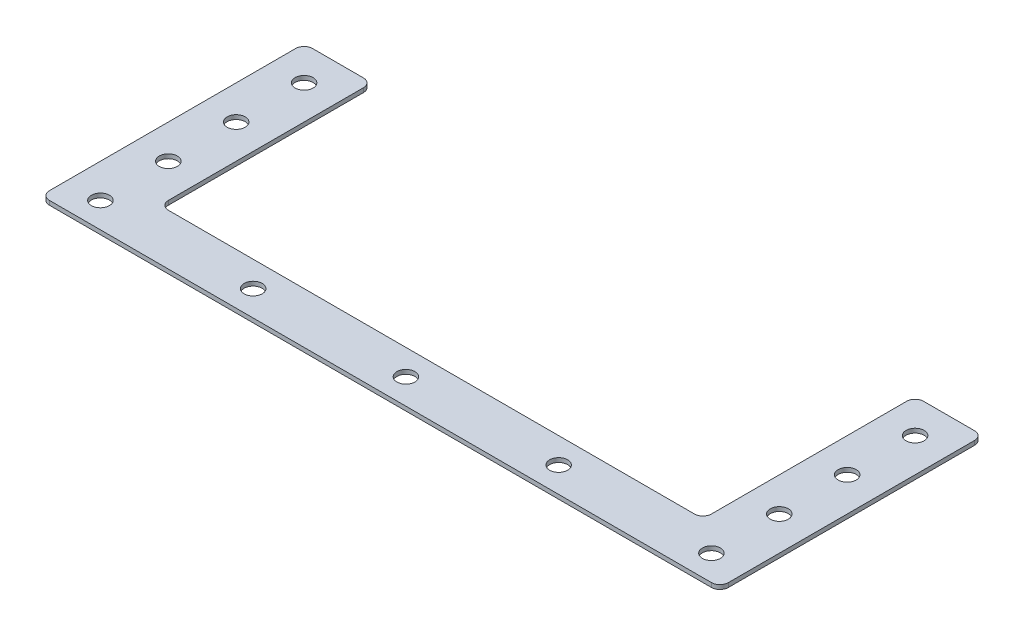
ISO-10303-21;
HEADER;
FILE_DESCRIPTION(('STEP AP214'),'2;1');
FILE_NAME('part.step','',(''),(''),'','','');
FILE_SCHEMA(('AUTOMOTIVE_DESIGN { 1 0 10303 214 1 1 1 1 }'));
ENDSEC;
DATA;
#1=APPLICATION_CONTEXT('core data for automotive mechanical design processes');
#2=APPLICATION_PROTOCOL_DEFINITION('international standard','automotive_design',2000,#1);
#3=PRODUCT_CONTEXT('',#1,'mechanical');
#4=PRODUCT('Part','Part','',(#3));
#5=PRODUCT_RELATED_PRODUCT_CATEGORY('part','',(#4));
#6=PRODUCT_DEFINITION_FORMATION('','',#4);
#7=PRODUCT_DEFINITION_CONTEXT('part definition',#1,'design');
#8=PRODUCT_DEFINITION('design','',#6,#7);
#9=PRODUCT_DEFINITION_SHAPE('','',#8);
#10=(LENGTH_UNIT() NAMED_UNIT(*) SI_UNIT(.MILLI.,.METRE.));
#11=(NAMED_UNIT(*) PLANE_ANGLE_UNIT() SI_UNIT($,.RADIAN.));
#12=(NAMED_UNIT(*) SI_UNIT($,.STERADIAN.) SOLID_ANGLE_UNIT());
#13=UNCERTAINTY_MEASURE_WITH_UNIT(LENGTH_MEASURE(1.E-05),#10,'distance_accuracy_value','');
#14=(GEOMETRIC_REPRESENTATION_CONTEXT(3) GLOBAL_UNCERTAINTY_ASSIGNED_CONTEXT((#13)) GLOBAL_UNIT_ASSIGNED_CONTEXT((#10,
#11,#12)) REPRESENTATION_CONTEXT('',''));
#15=CARTESIAN_POINT('',(0.,0.,0.));
#16=DIRECTION('',(0.,0.,1.));
#17=DIRECTION('',(1.,0.,0.));
#18=AXIS2_PLACEMENT_3D('',#15,#16,#17);
#19=CARTESIAN_POINT('',(-101.6,1.5875,0.));
#20=DIRECTION('',(1.,0.,0.));
#21=DIRECTION('',(0.,0.,-1.));
#22=AXIS2_PLACEMENT_3D('',#19,#20,#21);
#23=PLANE('',#22);
#24=DIRECTION('',(0.,0.,1.));
#25=VECTOR('',#24,1.);
#26=CARTESIAN_POINT('',(-101.6,1.5875,0.));
#27=LINE('',#26,#25);
#28=CARTESIAN_POINT('',(-101.6,1.5875,-46.0375));
#29=VERTEX_POINT('',#28);
#30=CARTESIAN_POINT('',(-101.6,1.5875,26.9875));
#31=VERTEX_POINT('',#30);
#32=EDGE_CURVE('E198',#29,#31,#27,.T.);
#33=ORIENTED_EDGE('',*,*,#32,.T.);
#34=DIRECTION('',(0.,-1.,0.));
#35=VECTOR('',#34,1.);
#36=CARTESIAN_POINT('',(-101.6,0.,26.9875));
#37=LINE('',#36,#35);
#38=CARTESIAN_POINT('',(-101.6,0.,26.9875));
#39=VERTEX_POINT('',#38);
#40=EDGE_CURVE('E249',#31,#39,#37,.T.);
#41=ORIENTED_EDGE('',*,*,#40,.T.);
#42=DIRECTION('',(0.,0.,1.));
#43=VECTOR('',#42,1.);
#44=CARTESIAN_POINT('',(-101.6,0.,0.));
#45=LINE('',#44,#43);
#46=CARTESIAN_POINT('',(-101.6,0.,-46.0375));
#47=VERTEX_POINT('',#46);
#48=EDGE_CURVE('E256',#47,#39,#45,.T.);
#49=ORIENTED_EDGE('',*,*,#48,.F.);
#50=DIRECTION('',(0.,-1.,0.));
#51=VECTOR('',#50,1.);
#52=CARTESIAN_POINT('',(-101.6,1.5875,-46.0375));
#53=LINE('',#52,#51);
#54=EDGE_CURVE('E247',#47,#29,#53,.F.);
#55=ORIENTED_EDGE('',*,*,#54,.T.);
#56=EDGE_LOOP('',(#33,#41,#49,#55));
#57=FACE_BOUND('',#56,.T.);
#58=ADVANCED_FACE('F39',(#57),#23,.T.);
#59=CARTESIAN_POINT('',(0.,1.5875,-49.2125));
#60=DIRECTION('',(0.,0.,-1.));
#61=DIRECTION('',(-1.,0.,0.));
#62=AXIS2_PLACEMENT_3D('',#59,#60,#61);
#63=PLANE('',#62);
#64=DIRECTION('',(1.,0.,0.));
#65=VECTOR('',#64,1.);
#66=CARTESIAN_POINT('',(0.,0.,-49.2125));
#67=LINE('',#66,#65);
#68=CARTESIAN_POINT('',(-123.825,0.,-49.2125));
#69=VERTEX_POINT('',#68);
#70=CARTESIAN_POINT('',(-104.775,0.,-49.2125));
#71=VERTEX_POINT('',#70);
#72=EDGE_CURVE('E186',#69,#71,#67,.T.);
#73=ORIENTED_EDGE('',*,*,#72,.F.);
#74=DIRECTION('',(0.,-1.,0.));
#75=VECTOR('',#74,1.);
#76=CARTESIAN_POINT('',(-123.825,1.5875,-49.2125));
#77=LINE('',#76,#75);
#78=CARTESIAN_POINT('',(-123.825,1.5875,-49.2125));
#79=VERTEX_POINT('',#78);
#80=EDGE_CURVE('E226',#69,#79,#77,.F.);
#81=ORIENTED_EDGE('',*,*,#80,.T.);
#82=DIRECTION('',(1.,0.,0.));
#83=VECTOR('',#82,1.);
#84=CARTESIAN_POINT('',(0.,1.5875,-49.2125));
#85=LINE('',#84,#83);
#86=CARTESIAN_POINT('',(-104.775,1.5875,-49.2125));
#87=VERTEX_POINT('',#86);
#88=EDGE_CURVE('E270',#79,#87,#85,.T.);
#89=ORIENTED_EDGE('',*,*,#88,.T.);
#90=DIRECTION('',(0.,-1.,0.));
#91=VECTOR('',#90,1.);
#92=CARTESIAN_POINT('',(-104.775,1.5875,-49.2125));
#93=LINE('',#92,#91);
#94=EDGE_CURVE('E223',#87,#71,#93,.T.);
#95=ORIENTED_EDGE('',*,*,#94,.T.);
#96=EDGE_LOOP('',(#73,#81,#89,#95));
#97=FACE_BOUND('',#96,.T.);
#98=ADVANCED_FACE('F295',(#97),#63,.T.);
#99=CARTESIAN_POINT('',(-127.,1.5875,0.));
#100=DIRECTION('',(1.,0.,0.));
#101=DIRECTION('',(0.,0.,-1.));
#102=AXIS2_PLACEMENT_3D('',#99,#100,#101);
#103=PLANE('',#102);
#104=DIRECTION('',(0.,0.,1.));
#105=VECTOR('',#104,1.);
#106=CARTESIAN_POINT('',(-127.,0.,0.));
#107=LINE('',#106,#105);
#108=CARTESIAN_POINT('',(-127.,0.,-46.0375));
#109=VERTEX_POINT('',#108);
#110=CARTESIAN_POINT('',(-127.,0.,46.0375));
#111=VERTEX_POINT('',#110);
#112=EDGE_CURVE('E181',#109,#111,#107,.T.);
#113=ORIENTED_EDGE('',*,*,#112,.T.);
#114=DIRECTION('',(0.,-1.,0.));
#115=VECTOR('',#114,1.);
#116=CARTESIAN_POINT('',(-127.,1.5875,46.0375));
#117=LINE('',#116,#115);
#118=CARTESIAN_POINT('',(-127.,1.5875,46.0375));
#119=VERTEX_POINT('',#118);
#120=EDGE_CURVE('E158',#111,#119,#117,.F.);
#121=ORIENTED_EDGE('',*,*,#120,.T.);
#122=DIRECTION('',(0.,0.,1.));
#123=VECTOR('',#122,1.);
#124=CARTESIAN_POINT('',(-127.,1.5875,0.));
#125=LINE('',#124,#123);
#126=CARTESIAN_POINT('',(-127.,1.5875,-46.0375));
#127=VERTEX_POINT('',#126);
#128=EDGE_CURVE('E273',#127,#119,#125,.T.);
#129=ORIENTED_EDGE('',*,*,#128,.F.);
#130=DIRECTION('',(0.,-1.,0.));
#131=VECTOR('',#130,1.);
#132=CARTESIAN_POINT('',(-127.,0.,-46.0375));
#133=LINE('',#132,#131);
#134=EDGE_CURVE('E163',#127,#109,#133,.T.);
#135=ORIENTED_EDGE('',*,*,#134,.T.);
#136=EDGE_LOOP('',(#113,#121,#129,#135));
#137=FACE_BOUND('',#136,.T.);
#138=ADVANCED_FACE('F304',(#137),#103,.F.);
#139=CARTESIAN_POINT('',(0.,1.5875,49.2125));
#140=DIRECTION('',(0.,0.,-1.));
#141=DIRECTION('',(-1.,0.,0.));
#142=AXIS2_PLACEMENT_3D('',#139,#140,#141);
#143=PLANE('',#142);
#144=DIRECTION('',(1.,0.,0.));
#145=VECTOR('',#144,1.);
#146=CARTESIAN_POINT('',(0.,1.5875,49.2125));
#147=LINE('',#146,#145);
#148=CARTESIAN_POINT('',(-123.825,1.5875,49.2125));
#149=VERTEX_POINT('',#148);
#150=CARTESIAN_POINT('',(123.825,1.5875,49.2125));
#151=VERTEX_POINT('',#150);
#152=EDGE_CURVE('E173',#149,#151,#147,.T.);
#153=ORIENTED_EDGE('',*,*,#152,.F.);
#154=DIRECTION('',(0.,-1.,0.));
#155=VECTOR('',#154,1.);
#156=CARTESIAN_POINT('',(-123.825,1.5875,49.2125));
#157=LINE('',#156,#155);
#158=CARTESIAN_POINT('',(-123.825,0.,49.2125));
#159=VERTEX_POINT('',#158);
#160=EDGE_CURVE('E157',#149,#159,#157,.T.);
#161=ORIENTED_EDGE('',*,*,#160,.T.);
#162=DIRECTION('',(1.,0.,0.));
#163=VECTOR('',#162,1.);
#164=CARTESIAN_POINT('',(0.,0.,49.2125));
#165=LINE('',#164,#163);
#166=CARTESIAN_POINT('',(123.825,0.,49.2125));
#167=VERTEX_POINT('',#166);
#168=EDGE_CURVE('E170',#159,#167,#165,.T.);
#169=ORIENTED_EDGE('',*,*,#168,.T.);
#170=DIRECTION('',(0.,-1.,0.));
#171=VECTOR('',#170,1.);
#172=CARTESIAN_POINT('',(123.825,1.5875,49.2125));
#173=LINE('',#172,#171);
#174=EDGE_CURVE('E175',#167,#151,#173,.F.);
#175=ORIENTED_EDGE('',*,*,#174,.T.);
#176=EDGE_LOOP('',(#153,#161,#169,#175));
#177=FACE_BOUND('',#176,.T.);
#178=ADVANCED_FACE('F169',(#177),#143,.F.);
#179=CARTESIAN_POINT('',(127.,1.5875,0.));
#180=DIRECTION('',(-1.,0.,0.));
#181=DIRECTION('',(0.,0.,1.));
#182=AXIS2_PLACEMENT_3D('',#179,#180,#181);
#183=PLANE('',#182);
#184=DIRECTION('',(0.,0.,-1.));
#185=VECTOR('',#184,1.);
#186=CARTESIAN_POINT('',(127.,1.5875,0.));
#187=LINE('',#186,#185);
#188=CARTESIAN_POINT('',(127.,1.5875,46.0375));
#189=VERTEX_POINT('',#188);
#190=CARTESIAN_POINT('',(127.,1.5875,-46.0375));
#191=VERTEX_POINT('',#190);
#192=EDGE_CURVE('E281',#189,#191,#187,.T.);
#193=ORIENTED_EDGE('',*,*,#192,.F.);
#194=DIRECTION('',(0.,-1.,0.));
#195=VECTOR('',#194,1.);
#196=CARTESIAN_POINT('',(127.,1.5875,46.0375));
#197=LINE('',#196,#195);
#198=CARTESIAN_POINT('',(127.,0.,46.0375));
#199=VERTEX_POINT('',#198);
#200=EDGE_CURVE('E239',#189,#199,#197,.T.);
#201=ORIENTED_EDGE('',*,*,#200,.T.);
#202=DIRECTION('',(0.,0.,-1.));
#203=VECTOR('',#202,1.);
#204=CARTESIAN_POINT('',(127.,0.,0.));
#205=LINE('',#204,#203);
#206=CARTESIAN_POINT('',(127.,0.,-46.0375));
#207=VERTEX_POINT('',#206);
#208=EDGE_CURVE('E180',#199,#207,#205,.T.);
#209=ORIENTED_EDGE('',*,*,#208,.T.);
#210=DIRECTION('',(0.,-1.,0.));
#211=VECTOR('',#210,1.);
#212=CARTESIAN_POINT('',(127.,1.5875,-46.0375));
#213=LINE('',#212,#211);
#214=EDGE_CURVE('E237',#207,#191,#213,.F.);
#215=ORIENTED_EDGE('',*,*,#214,.T.);
#216=EDGE_LOOP('',(#193,#201,#209,#215));
#217=FACE_BOUND('',#216,.T.);
#218=ADVANCED_FACE('F311',(#217),#183,.F.);
#219=CARTESIAN_POINT('',(0.,1.5875,-49.2125));
#220=DIRECTION('',(0.,0.,-1.));
#221=DIRECTION('',(-1.,0.,0.));
#222=AXIS2_PLACEMENT_3D('',#219,#220,#221);
#223=PLANE('',#222);
#224=DIRECTION('',(1.,0.,0.));
#225=VECTOR('',#224,1.);
#226=CARTESIAN_POINT('',(0.,0.,-49.2125));
#227=LINE('',#226,#225);
#228=CARTESIAN_POINT('',(104.775,0.,-49.2125));
#229=VERTEX_POINT('',#228);
#230=CARTESIAN_POINT('',(123.825,0.,-49.2125));
#231=VERTEX_POINT('',#230);
#232=EDGE_CURVE('E184',#229,#231,#227,.T.);
#233=ORIENTED_EDGE('',*,*,#232,.F.);
#234=DIRECTION('',(0.,-1.,0.));
#235=VECTOR('',#234,1.);
#236=CARTESIAN_POINT('',(104.775,1.5875,-49.2125));
#237=LINE('',#236,#235);
#238=CARTESIAN_POINT('',(104.775,1.5875,-49.2125));
#239=VERTEX_POINT('',#238);
#240=EDGE_CURVE('E245',#229,#239,#237,.F.);
#241=ORIENTED_EDGE('',*,*,#240,.T.);
#242=DIRECTION('',(1.,0.,0.));
#243=VECTOR('',#242,1.);
#244=CARTESIAN_POINT('',(0.,1.5875,-49.2125));
#245=LINE('',#244,#243);
#246=CARTESIAN_POINT('',(123.825,1.5875,-49.2125));
#247=VERTEX_POINT('',#246);
#248=EDGE_CURVE('E284',#239,#247,#245,.T.);
#249=ORIENTED_EDGE('',*,*,#248,.T.);
#250=DIRECTION('',(0.,-1.,0.));
#251=VECTOR('',#250,1.);
#252=CARTESIAN_POINT('',(123.825,0.,-49.2125));
#253=LINE('',#252,#251);
#254=EDGE_CURVE('E242',#247,#231,#253,.T.);
#255=ORIENTED_EDGE('',*,*,#254,.T.);
#256=EDGE_LOOP('',(#233,#241,#249,#255));
#257=FACE_BOUND('',#256,.T.);
#258=ADVANCED_FACE('F371',(#257),#223,.T.);
#259=CARTESIAN_POINT('',(101.6,1.5875,0.));
#260=DIRECTION('',(-1.,0.,0.));
#261=DIRECTION('',(0.,0.,1.));
#262=AXIS2_PLACEMENT_3D('',#259,#260,#261);
#263=PLANE('',#262);
#264=DIRECTION('',(0.,0.,-1.));
#265=VECTOR('',#264,1.);
#266=CARTESIAN_POINT('',(101.6,0.,0.));
#267=LINE('',#266,#265);
#268=CARTESIAN_POINT('',(101.6,0.,26.9875));
#269=VERTEX_POINT('',#268);
#270=CARTESIAN_POINT('',(101.6,0.,-46.0375));
#271=VERTEX_POINT('',#270);
#272=EDGE_CURVE('E192',#269,#271,#267,.T.);
#273=ORIENTED_EDGE('',*,*,#272,.F.);
#274=DIRECTION('',(0.,-1.,0.));
#275=VECTOR('',#274,1.);
#276=CARTESIAN_POINT('',(101.6,1.5875,26.9875));
#277=LINE('',#276,#275);
#278=CARTESIAN_POINT('',(101.6,1.5875,26.9875));
#279=VERTEX_POINT('',#278);
#280=EDGE_CURVE('E235',#269,#279,#277,.F.);
#281=ORIENTED_EDGE('',*,*,#280,.T.);
#282=DIRECTION('',(0.,0.,-1.));
#283=VECTOR('',#282,1.);
#284=CARTESIAN_POINT('',(101.6,1.5875,0.));
#285=LINE('',#284,#283);
#286=CARTESIAN_POINT('',(101.6,1.5875,-46.0375));
#287=VERTEX_POINT('',#286);
#288=EDGE_CURVE('E287',#279,#287,#285,.T.);
#289=ORIENTED_EDGE('',*,*,#288,.T.);
#290=DIRECTION('',(0.,-1.,0.));
#291=VECTOR('',#290,1.);
#292=CARTESIAN_POINT('',(101.6,1.5875,-46.0375));
#293=LINE('',#292,#291);
#294=EDGE_CURVE('E232',#287,#271,#293,.T.);
#295=ORIENTED_EDGE('',*,*,#294,.T.);
#296=EDGE_LOOP('',(#273,#281,#289,#295));
#297=FACE_BOUND('',#296,.T.);
#298=ADVANCED_FACE('F368',(#297),#263,.T.);
#299=CARTESIAN_POINT('',(0.,1.5875,30.1625));
#300=DIRECTION('',(0.,0.,-1.));
#301=DIRECTION('',(-1.,0.,0.));
#302=AXIS2_PLACEMENT_3D('',#299,#300,#301);
#303=PLANE('',#302);
#304=DIRECTION('',(1.,0.,0.));
#305=VECTOR('',#304,1.);
#306=CARTESIAN_POINT('',(0.,1.5875,30.1625));
#307=LINE('',#306,#305);
#308=CARTESIAN_POINT('',(-98.425,1.5875,30.1625));
#309=VERTEX_POINT('',#308);
#310=CARTESIAN_POINT('',(98.425,1.5875,30.1625));
#311=VERTEX_POINT('',#310);
#312=EDGE_CURVE('E199',#309,#311,#307,.T.);
#313=ORIENTED_EDGE('',*,*,#312,.T.);
#314=DIRECTION('',(0.,-1.,0.));
#315=VECTOR('',#314,1.);
#316=CARTESIAN_POINT('',(98.425,0.,30.1625));
#317=LINE('',#316,#315);
#318=CARTESIAN_POINT('',(98.425,0.,30.1625));
#319=VERTEX_POINT('',#318);
#320=EDGE_CURVE('E229',#311,#319,#317,.T.);
#321=ORIENTED_EDGE('',*,*,#320,.T.);
#322=DIRECTION('',(1.,0.,0.));
#323=VECTOR('',#322,1.);
#324=CARTESIAN_POINT('',(0.,0.,30.1625));
#325=LINE('',#324,#323);
#326=CARTESIAN_POINT('',(-98.425,0.,30.1625));
#327=VERTEX_POINT('',#326);
#328=EDGE_CURVE('E195',#327,#319,#325,.T.);
#329=ORIENTED_EDGE('',*,*,#328,.F.);
#330=DIRECTION('',(0.,-1.,0.));
#331=VECTOR('',#330,1.);
#332=CARTESIAN_POINT('',(-98.425,1.5875,30.1625));
#333=LINE('',#332,#331);
#334=EDGE_CURVE('E61',#327,#309,#333,.F.);
#335=ORIENTED_EDGE('',*,*,#334,.T.);
#336=EDGE_LOOP('',(#313,#321,#329,#335));
#337=FACE_BOUND('',#336,.T.);
#338=ADVANCED_FACE('F259',(#337),#303,.T.);
#339=CARTESIAN_POINT('',(0.,1.5875,0.));
#340=DIRECTION('',(0.,1.,0.));
#341=DIRECTION('',(0.,0.,1.));
#342=AXIS2_PLACEMENT_3D('',#339,#340,#341);
#343=PLANE('',#342);
#344=CARTESIAN_POINT('',(-114.3,1.5875,-36.5124999999999));
#345=DIRECTION('',(0.,1.,0.));
#346=DIRECTION('',(0.,0.,1.));
#347=AXIS2_PLACEMENT_3D('',#344,#345,#346);
#348=CIRCLE('',#347,3.37819999999998);
#349=CARTESIAN_POINT('',(-114.3,1.5875,-33.1343));
#350=VERTEX_POINT('',#349);
#351=EDGE_CURVE('E555',#350,#350,#348,.T.);
#352=ORIENTED_EDGE('',*,*,#351,.F.);
#353=EDGE_LOOP('',(#352));
#354=FACE_BOUND('',#353,.T.);
#355=CARTESIAN_POINT('',(-114.3,1.5875,-11.1124999999999));
#356=DIRECTION('',(0.,1.,0.));
#357=DIRECTION('',(0.,0.,1.));
#358=AXIS2_PLACEMENT_3D('',#355,#356,#357);
#359=CIRCLE('',#358,3.37819999999998);
#360=CARTESIAN_POINT('',(-114.3,1.5875,-7.73429999999996));
#361=VERTEX_POINT('',#360);
#362=EDGE_CURVE('E557',#361,#361,#359,.T.);
#363=ORIENTED_EDGE('',*,*,#362,.F.);
#364=EDGE_LOOP('',(#363));
#365=FACE_BOUND('',#364,.T.);
#366=CARTESIAN_POINT('',(-114.299999999999,1.5875,14.2875));
#367=DIRECTION('',(0.,1.,0.));
#368=DIRECTION('',(0.,0.,1.));
#369=AXIS2_PLACEMENT_3D('',#366,#367,#368);
#370=CIRCLE('',#369,3.37819999999998);
#371=CARTESIAN_POINT('',(-114.299999999999,1.5875,17.6657));
#372=VERTEX_POINT('',#371);
#373=EDGE_CURVE('E565',#372,#372,#370,.T.);
#374=ORIENTED_EDGE('',*,*,#373,.F.);
#375=EDGE_LOOP('',(#374));
#376=FACE_BOUND('',#375,.T.);
#377=CARTESIAN_POINT('',(-57.1499999999992,1.5875,39.6875));
#378=DIRECTION('',(0.,1.,0.));
#379=DIRECTION('',(0.,0.,1.));
#380=AXIS2_PLACEMENT_3D('',#377,#378,#379);
#381=CIRCLE('',#380,3.37819999999999);
#382=CARTESIAN_POINT('',(-57.1499999999992,1.5875,43.0657));
#383=VERTEX_POINT('',#382);
#384=EDGE_CURVE('E571',#383,#383,#381,.T.);
#385=ORIENTED_EDGE('',*,*,#384,.F.);
#386=EDGE_LOOP('',(#385));
#387=FACE_BOUND('',#386,.T.);
#388=CARTESIAN_POINT('',(8.18789480661053E-13,1.5875,39.6875));
#389=DIRECTION('',(0.,1.,0.));
#390=DIRECTION('',(0.,0.,1.));
#391=AXIS2_PLACEMENT_3D('',#388,#389,#390);
#392=CIRCLE('',#391,3.37819999999999);
#393=CARTESIAN_POINT('',(8.18789480661053E-13,1.5875,43.0657));
#394=VERTEX_POINT('',#393);
#395=EDGE_CURVE('E577',#394,#394,#392,.T.);
#396=ORIENTED_EDGE('',*,*,#395,.F.);
#397=EDGE_LOOP('',(#396));
#398=FACE_BOUND('',#397,.T.);
#399=CARTESIAN_POINT('',(57.1499999999992,1.5875,39.6875));
#400=DIRECTION('',(0.,1.,0.));
#401=DIRECTION('',(0.,0.,1.));
#402=AXIS2_PLACEMENT_3D('',#399,#400,#401);
#403=CIRCLE('',#402,3.37819999999998);
#404=CARTESIAN_POINT('',(57.1499999999992,1.5875,43.0657));
#405=VERTEX_POINT('',#404);
#406=EDGE_CURVE('E583',#405,#405,#403,.T.);
#407=ORIENTED_EDGE('',*,*,#406,.F.);
#408=EDGE_LOOP('',(#407));
#409=FACE_BOUND('',#408,.T.);
#410=CARTESIAN_POINT('',(114.299999999999,1.5875,14.2875));
#411=DIRECTION('',(0.,1.,0.));
#412=DIRECTION('',(0.,0.,1.));
#413=AXIS2_PLACEMENT_3D('',#410,#411,#412);
#414=CIRCLE('',#413,3.37819999999998);
#415=CARTESIAN_POINT('',(114.299999999999,1.5875,17.6657));
#416=VERTEX_POINT('',#415);
#417=EDGE_CURVE('E589',#416,#416,#414,.T.);
#418=ORIENTED_EDGE('',*,*,#417,.F.);
#419=EDGE_LOOP('',(#418));
#420=FACE_BOUND('',#419,.T.);
#421=CARTESIAN_POINT('',(114.3,1.5875,-11.1124999999999));
#422=DIRECTION('',(0.,1.,0.));
#423=DIRECTION('',(0.,0.,1.));
#424=AXIS2_PLACEMENT_3D('',#421,#422,#423);
#425=CIRCLE('',#424,3.37819999999998);
#426=CARTESIAN_POINT('',(114.3,1.5875,-7.73429999999996));
#427=VERTEX_POINT('',#426);
#428=EDGE_CURVE('E595',#427,#427,#425,.T.);
#429=ORIENTED_EDGE('',*,*,#428,.F.);
#430=EDGE_LOOP('',(#429));
#431=FACE_BOUND('',#430,.T.);
#432=CARTESIAN_POINT('',(114.3,1.5875,-36.5124999999999));
#433=DIRECTION('',(0.,1.,0.));
#434=DIRECTION('',(0.,0.,1.));
#435=AXIS2_PLACEMENT_3D('',#432,#433,#434);
#436=CIRCLE('',#435,3.37819999999998);
#437=CARTESIAN_POINT('',(114.3,1.5875,-33.1343));
#438=VERTEX_POINT('',#437);
#439=EDGE_CURVE('E601',#438,#438,#436,.T.);
#440=ORIENTED_EDGE('',*,*,#439,.F.);
#441=EDGE_LOOP('',(#440));
#442=FACE_BOUND('',#441,.T.);
#443=CARTESIAN_POINT('',(-114.3,1.5875,39.6875));
#444=DIRECTION('',(0.,1.,0.));
#445=DIRECTION('',(0.,0.,1.));
#446=AXIS2_PLACEMENT_3D('',#443,#444,#445);
#447=CIRCLE('',#446,3.37819999999998);
#448=CARTESIAN_POINT('',(-114.3,1.5875,43.0657));
#449=VERTEX_POINT('',#448);
#450=EDGE_CURVE('E607',#449,#449,#447,.T.);
#451=ORIENTED_EDGE('',*,*,#450,.F.);
#452=EDGE_LOOP('',(#451));
#453=FACE_BOUND('',#452,.T.);
#454=CARTESIAN_POINT('',(114.3,1.5875,39.6875));
#455=DIRECTION('',(0.,1.,0.));
#456=DIRECTION('',(0.,0.,1.));
#457=AXIS2_PLACEMENT_3D('',#454,#455,#456);
#458=CIRCLE('',#457,3.37819999999998);
#459=CARTESIAN_POINT('',(114.3,1.5875,43.0657));
#460=VERTEX_POINT('',#459);
#461=EDGE_CURVE('E612',#460,#460,#458,.T.);
#462=ORIENTED_EDGE('',*,*,#461,.F.);
#463=EDGE_LOOP('',(#462));
#464=FACE_BOUND('',#463,.T.);
#465=ORIENTED_EDGE('',*,*,#128,.T.);
#466=CARTESIAN_POINT('',(-123.825,1.5875,46.0375));
#467=DIRECTION('',(0.,1.,0.));
#468=DIRECTION('',(0.,0.,1.));
#469=AXIS2_PLACEMENT_3D('',#466,#467,#468);
#470=CIRCLE('',#469,3.175);
#471=EDGE_CURVE('E221',#119,#149,#470,.T.);
#472=ORIENTED_EDGE('',*,*,#471,.T.);
#473=ORIENTED_EDGE('',*,*,#152,.T.);
#474=CARTESIAN_POINT('',(123.825,1.5875,46.0375));
#475=DIRECTION('',(0.,1.,0.));
#476=DIRECTION('',(0.,0.,1.));
#477=AXIS2_PLACEMENT_3D('',#474,#475,#476);
#478=CIRCLE('',#477,3.175);
#479=EDGE_CURVE('E217',#151,#189,#478,.T.);
#480=ORIENTED_EDGE('',*,*,#479,.T.);
#481=ORIENTED_EDGE('',*,*,#192,.T.);
#482=CARTESIAN_POINT('',(123.825,1.5875,-46.0375));
#483=DIRECTION('',(0.,1.,0.));
#484=DIRECTION('',(0.,0.,1.));
#485=AXIS2_PLACEMENT_3D('',#482,#483,#484);
#486=CIRCLE('',#485,3.175);
#487=EDGE_CURVE('E213',#191,#247,#486,.T.);
#488=ORIENTED_EDGE('',*,*,#487,.T.);
#489=ORIENTED_EDGE('',*,*,#248,.F.);
#490=CARTESIAN_POINT('',(104.775,1.5875,-46.0375));
#491=DIRECTION('',(0.,1.,0.));
#492=DIRECTION('',(0.,0.,1.));
#493=AXIS2_PLACEMENT_3D('',#490,#491,#492);
#494=CIRCLE('',#493,3.175);
#495=EDGE_CURVE('E215',#239,#287,#494,.T.);
#496=ORIENTED_EDGE('',*,*,#495,.T.);
#497=ORIENTED_EDGE('',*,*,#288,.F.);
#498=CARTESIAN_POINT('',(98.425,1.5875,26.9875));
#499=DIRECTION('',(0.,1.,0.));
#500=DIRECTION('',(0.,0.,1.));
#501=AXIS2_PLACEMENT_3D('',#498,#499,#500);
#502=CIRCLE('',#501,3.175);
#503=EDGE_CURVE('E54',#279,#311,#502,.F.);
#504=ORIENTED_EDGE('',*,*,#503,.T.);
#505=ORIENTED_EDGE('',*,*,#312,.F.);
#506=CARTESIAN_POINT('',(-98.425,1.5875,26.9875));
#507=DIRECTION('',(0.,1.,0.));
#508=DIRECTION('',(0.,0.,1.));
#509=AXIS2_PLACEMENT_3D('',#506,#507,#508);
#510=CIRCLE('',#509,3.175);
#511=EDGE_CURVE('E11',#309,#31,#510,.F.);
#512=ORIENTED_EDGE('',*,*,#511,.T.);
#513=ORIENTED_EDGE('',*,*,#32,.F.);
#514=CARTESIAN_POINT('',(-104.775,1.5875,-46.0375));
#515=DIRECTION('',(0.,1.,0.));
#516=DIRECTION('',(0.,0.,1.));
#517=AXIS2_PLACEMENT_3D('',#514,#515,#516);
#518=CIRCLE('',#517,3.175);
#519=EDGE_CURVE('E211',#29,#87,#518,.T.);
#520=ORIENTED_EDGE('',*,*,#519,.T.);
#521=ORIENTED_EDGE('',*,*,#88,.F.);
#522=CARTESIAN_POINT('',(-123.825,1.5875,-46.0375));
#523=DIRECTION('',(0.,1.,0.));
#524=DIRECTION('',(0.,0.,1.));
#525=AXIS2_PLACEMENT_3D('',#522,#523,#524);
#526=CIRCLE('',#525,3.175);
#527=EDGE_CURVE('E219',#79,#127,#526,.T.);
#528=ORIENTED_EDGE('',*,*,#527,.T.);
#529=EDGE_LOOP('',(#465,#472,#473,#480,#481,#488,#489,#496,#497,#504,#505,#512,#513,#520,#521,#528));
#530=FACE_BOUND('',#529,.T.);
#531=ADVANCED_FACE('F266',(#354,#365,#376,#387,#398,#409,#420,#431,#442,#453,#464,#530),#343,.T.);
#532=CARTESIAN_POINT('',(0.,0.,0.));
#533=DIRECTION('',(0.,1.,0.));
#534=DIRECTION('',(0.,0.,1.));
#535=AXIS2_PLACEMENT_3D('',#532,#533,#534);
#536=PLANE('',#535);
#537=CARTESIAN_POINT('',(-114.3,0.,-36.5124999999999));
#538=DIRECTION('',(0.,1.,0.));
#539=DIRECTION('',(0.,0.,1.));
#540=AXIS2_PLACEMENT_3D('',#537,#538,#539);
#541=CIRCLE('',#540,3.3782);
#542=CARTESIAN_POINT('',(-114.3,0.,-33.1343));
#543=VERTEX_POINT('',#542);
#544=EDGE_CURVE('E552',#543,#543,#541,.T.);
#545=ORIENTED_EDGE('',*,*,#544,.T.);
#546=EDGE_LOOP('',(#545));
#547=FACE_BOUND('',#546,.T.);
#548=CARTESIAN_POINT('',(-114.3,0.,-11.1124999999999));
#549=DIRECTION('',(0.,1.,0.));
#550=DIRECTION('',(0.,0.,1.));
#551=AXIS2_PLACEMENT_3D('',#548,#549,#550);
#552=CIRCLE('',#551,3.3782);
#553=CARTESIAN_POINT('',(-114.3,0.,-7.73429999999995));
#554=VERTEX_POINT('',#553);
#555=EDGE_CURVE('E562',#554,#554,#552,.T.);
#556=ORIENTED_EDGE('',*,*,#555,.T.);
#557=EDGE_LOOP('',(#556));
#558=FACE_BOUND('',#557,.T.);
#559=CARTESIAN_POINT('',(-114.299999999999,0.,14.2875));
#560=DIRECTION('',(0.,1.,0.));
#561=DIRECTION('',(0.,0.,1.));
#562=AXIS2_PLACEMENT_3D('',#559,#560,#561);
#563=CIRCLE('',#562,3.3782);
#564=CARTESIAN_POINT('',(-114.299999999999,0.,17.6657));
#565=VERTEX_POINT('',#564);
#566=EDGE_CURVE('E568',#565,#565,#563,.T.);
#567=ORIENTED_EDGE('',*,*,#566,.T.);
#568=EDGE_LOOP('',(#567));
#569=FACE_BOUND('',#568,.T.);
#570=CARTESIAN_POINT('',(-57.1499999999992,0.,39.6875));
#571=DIRECTION('',(0.,1.,0.));
#572=DIRECTION('',(0.,0.,1.));
#573=AXIS2_PLACEMENT_3D('',#570,#571,#572);
#574=CIRCLE('',#573,3.3782);
#575=CARTESIAN_POINT('',(-57.1499999999992,0.,43.0657));
#576=VERTEX_POINT('',#575);
#577=EDGE_CURVE('E574',#576,#576,#574,.T.);
#578=ORIENTED_EDGE('',*,*,#577,.T.);
#579=EDGE_LOOP('',(#578));
#580=FACE_BOUND('',#579,.T.);
#581=CARTESIAN_POINT('',(8.18789480661053E-13,0.,39.6875));
#582=DIRECTION('',(0.,1.,0.));
#583=DIRECTION('',(0.,0.,1.));
#584=AXIS2_PLACEMENT_3D('',#581,#582,#583);
#585=CIRCLE('',#584,3.3782);
#586=CARTESIAN_POINT('',(8.18789480661053E-13,0.,43.0657));
#587=VERTEX_POINT('',#586);
#588=EDGE_CURVE('E580',#587,#587,#585,.T.);
#589=ORIENTED_EDGE('',*,*,#588,.T.);
#590=EDGE_LOOP('',(#589));
#591=FACE_BOUND('',#590,.T.);
#592=CARTESIAN_POINT('',(57.1499999999992,0.,39.6875));
#593=DIRECTION('',(0.,1.,0.));
#594=DIRECTION('',(0.,0.,1.));
#595=AXIS2_PLACEMENT_3D('',#592,#593,#594);
#596=CIRCLE('',#595,3.3782);
#597=CARTESIAN_POINT('',(57.1499999999992,0.,43.0657));
#598=VERTEX_POINT('',#597);
#599=EDGE_CURVE('E586',#598,#598,#596,.T.);
#600=ORIENTED_EDGE('',*,*,#599,.T.);
#601=EDGE_LOOP('',(#600));
#602=FACE_BOUND('',#601,.T.);
#603=CARTESIAN_POINT('',(114.299999999999,0.,14.2875));
#604=DIRECTION('',(0.,1.,0.));
#605=DIRECTION('',(0.,0.,1.));
#606=AXIS2_PLACEMENT_3D('',#603,#604,#605);
#607=CIRCLE('',#606,3.3782);
#608=CARTESIAN_POINT('',(114.299999999999,0.,17.6657));
#609=VERTEX_POINT('',#608);
#610=EDGE_CURVE('E592',#609,#609,#607,.T.);
#611=ORIENTED_EDGE('',*,*,#610,.T.);
#612=EDGE_LOOP('',(#611));
#613=FACE_BOUND('',#612,.T.);
#614=CARTESIAN_POINT('',(114.3,0.,-11.1124999999999));
#615=DIRECTION('',(0.,1.,0.));
#616=DIRECTION('',(0.,0.,1.));
#617=AXIS2_PLACEMENT_3D('',#614,#615,#616);
#618=CIRCLE('',#617,3.3782);
#619=CARTESIAN_POINT('',(114.3,0.,-7.73429999999995));
#620=VERTEX_POINT('',#619);
#621=EDGE_CURVE('E598',#620,#620,#618,.T.);
#622=ORIENTED_EDGE('',*,*,#621,.T.);
#623=EDGE_LOOP('',(#622));
#624=FACE_BOUND('',#623,.T.);
#625=CARTESIAN_POINT('',(114.3,0.,-36.5124999999999));
#626=DIRECTION('',(0.,1.,0.));
#627=DIRECTION('',(0.,0.,1.));
#628=AXIS2_PLACEMENT_3D('',#625,#626,#627);
#629=CIRCLE('',#628,3.3782);
#630=CARTESIAN_POINT('',(114.3,0.,-33.1343));
#631=VERTEX_POINT('',#630);
#632=EDGE_CURVE('E604',#631,#631,#629,.T.);
#633=ORIENTED_EDGE('',*,*,#632,.T.);
#634=EDGE_LOOP('',(#633));
#635=FACE_BOUND('',#634,.T.);
#636=CARTESIAN_POINT('',(-114.3,0.,39.6875));
#637=DIRECTION('',(0.,1.,0.));
#638=DIRECTION('',(0.,0.,1.));
#639=AXIS2_PLACEMENT_3D('',#636,#637,#638);
#640=CIRCLE('',#639,3.3782);
#641=CARTESIAN_POINT('',(-114.3,0.,43.0657));
#642=VERTEX_POINT('',#641);
#643=EDGE_CURVE('E610',#642,#642,#640,.T.);
#644=ORIENTED_EDGE('',*,*,#643,.T.);
#645=EDGE_LOOP('',(#644));
#646=FACE_BOUND('',#645,.T.);
#647=CARTESIAN_POINT('',(114.3,0.,39.6875));
#648=DIRECTION('',(0.,1.,0.));
#649=DIRECTION('',(0.,0.,1.));
#650=AXIS2_PLACEMENT_3D('',#647,#648,#649);
#651=CIRCLE('',#650,3.3782);
#652=CARTESIAN_POINT('',(114.3,0.,43.0657));
#653=VERTEX_POINT('',#652);
#654=EDGE_CURVE('E276',#653,#653,#651,.T.);
#655=ORIENTED_EDGE('',*,*,#654,.T.);
#656=EDGE_LOOP('',(#655));
#657=FACE_BOUND('',#656,.T.);
#658=ORIENTED_EDGE('',*,*,#168,.F.);
#659=CARTESIAN_POINT('',(-123.825,0.,46.0375));
#660=DIRECTION('',(0.,1.,0.));
#661=DIRECTION('',(0.,0.,1.));
#662=AXIS2_PLACEMENT_3D('',#659,#660,#661);
#663=CIRCLE('',#662,3.175);
#664=EDGE_CURVE('E153',#159,#111,#663,.F.);
#665=ORIENTED_EDGE('',*,*,#664,.T.);
#666=ORIENTED_EDGE('',*,*,#112,.F.);
#667=CARTESIAN_POINT('',(-123.825,0.,-46.0375));
#668=DIRECTION('',(0.,1.,0.));
#669=DIRECTION('',(0.,0.,1.));
#670=AXIS2_PLACEMENT_3D('',#667,#668,#669);
#671=CIRCLE('',#670,3.175);
#672=EDGE_CURVE('E164',#109,#69,#671,.F.);
#673=ORIENTED_EDGE('',*,*,#672,.T.);
#674=ORIENTED_EDGE('',*,*,#72,.T.);
#675=CARTESIAN_POINT('',(-104.775,0.,-46.0375));
#676=DIRECTION('',(0.,1.,0.));
#677=DIRECTION('',(0.,0.,1.));
#678=AXIS2_PLACEMENT_3D('',#675,#676,#677);
#679=CIRCLE('',#678,3.175);
#680=EDGE_CURVE('E174',#71,#47,#679,.F.);
#681=ORIENTED_EDGE('',*,*,#680,.T.);
#682=ORIENTED_EDGE('',*,*,#48,.T.);
#683=CARTESIAN_POINT('',(-98.425,0.,26.9875));
#684=DIRECTION('',(0.,1.,0.));
#685=DIRECTION('',(0.,0.,1.));
#686=AXIS2_PLACEMENT_3D('',#683,#684,#685);
#687=CIRCLE('',#686,3.175);
#688=EDGE_CURVE('E47',#39,#327,#687,.T.);
#689=ORIENTED_EDGE('',*,*,#688,.T.);
#690=ORIENTED_EDGE('',*,*,#328,.T.);
#691=CARTESIAN_POINT('',(98.425,0.,26.9875));
#692=DIRECTION('',(0.,1.,0.));
#693=DIRECTION('',(0.,0.,1.));
#694=AXIS2_PLACEMENT_3D('',#691,#692,#693);
#695=CIRCLE('',#694,3.175);
#696=EDGE_CURVE('E252',#319,#269,#695,.T.);
#697=ORIENTED_EDGE('',*,*,#696,.T.);
#698=ORIENTED_EDGE('',*,*,#272,.T.);
#699=CARTESIAN_POINT('',(104.775,0.,-46.0375));
#700=DIRECTION('',(0.,1.,0.));
#701=DIRECTION('',(0.,0.,1.));
#702=AXIS2_PLACEMENT_3D('',#699,#700,#701);
#703=CIRCLE('',#702,3.175);
#704=EDGE_CURVE('E204',#271,#229,#703,.F.);
#705=ORIENTED_EDGE('',*,*,#704,.T.);
#706=ORIENTED_EDGE('',*,*,#232,.T.);
#707=CARTESIAN_POINT('',(123.825,0.,-46.0375));
#708=DIRECTION('',(0.,1.,0.));
#709=DIRECTION('',(0.,0.,1.));
#710=AXIS2_PLACEMENT_3D('',#707,#708,#709);
#711=CIRCLE('',#710,3.175);
#712=EDGE_CURVE('E202',#231,#207,#711,.F.);
#713=ORIENTED_EDGE('',*,*,#712,.T.);
#714=ORIENTED_EDGE('',*,*,#208,.F.);
#715=CARTESIAN_POINT('',(123.825,0.,46.0375));
#716=DIRECTION('',(0.,1.,0.));
#717=DIRECTION('',(0.,0.,1.));
#718=AXIS2_PLACEMENT_3D('',#715,#716,#717);
#719=CIRCLE('',#718,3.175);
#720=EDGE_CURVE('E179',#199,#167,#719,.F.);
#721=ORIENTED_EDGE('',*,*,#720,.T.);
#722=EDGE_LOOP('',(#658,#665,#666,#673,#674,#681,#682,#689,#690,#697,#698,#705,#706,#713,#714,#721));
#723=FACE_BOUND('',#722,.T.);
#724=ADVANCED_FACE('F177',(#547,#558,#569,#580,#591,#602,#613,#624,#635,#646,#657,#723),#536,.F.);
#725=CARTESIAN_POINT('',(-123.825,1.5875,46.0375));
#726=DIRECTION('',(0.,-1.,0.));
#727=DIRECTION('',(0.,0.,-1.));
#728=AXIS2_PLACEMENT_3D('',#725,#726,#727);
#729=CYLINDRICAL_SURFACE('',#728,3.175);
#730=ORIENTED_EDGE('',*,*,#471,.F.);
#731=ORIENTED_EDGE('',*,*,#120,.F.);
#732=ORIENTED_EDGE('',*,*,#664,.F.);
#733=ORIENTED_EDGE('',*,*,#160,.F.);
#734=EDGE_LOOP('',(#730,#731,#732,#733));
#735=FACE_BOUND('',#734,.T.);
#736=ADVANCED_FACE('F156',(#735),#729,.T.);
#737=CARTESIAN_POINT('',(-123.825,1.5875,-46.0375));
#738=DIRECTION('',(0.,1.,0.));
#739=DIRECTION('',(0.,0.,1.));
#740=AXIS2_PLACEMENT_3D('',#737,#738,#739);
#741=CYLINDRICAL_SURFACE('',#740,3.175);
#742=ORIENTED_EDGE('',*,*,#527,.F.);
#743=ORIENTED_EDGE('',*,*,#80,.F.);
#744=ORIENTED_EDGE('',*,*,#672,.F.);
#745=ORIENTED_EDGE('',*,*,#134,.F.);
#746=EDGE_LOOP('',(#742,#743,#744,#745));
#747=FACE_BOUND('',#746,.T.);
#748=ADVANCED_FACE('F300',(#747),#741,.T.);
#749=CARTESIAN_POINT('',(98.425,1.5875,26.9875));
#750=DIRECTION('',(0.,1.,0.));
#751=DIRECTION('',(0.,0.,1.));
#752=AXIS2_PLACEMENT_3D('',#749,#750,#751);
#753=CYLINDRICAL_SURFACE('',#752,3.175);
#754=ORIENTED_EDGE('',*,*,#503,.F.);
#755=ORIENTED_EDGE('',*,*,#280,.F.);
#756=ORIENTED_EDGE('',*,*,#696,.F.);
#757=ORIENTED_EDGE('',*,*,#320,.F.);
#758=EDGE_LOOP('',(#754,#755,#756,#757));
#759=FACE_BOUND('',#758,.T.);
#760=ADVANCED_FACE('F323',(#759),#753,.F.);
#761=CARTESIAN_POINT('',(123.825,1.5875,46.0375));
#762=DIRECTION('',(0.,-1.,0.));
#763=DIRECTION('',(0.,0.,-1.));
#764=AXIS2_PLACEMENT_3D('',#761,#762,#763);
#765=CYLINDRICAL_SURFACE('',#764,3.175);
#766=ORIENTED_EDGE('',*,*,#479,.F.);
#767=ORIENTED_EDGE('',*,*,#174,.F.);
#768=ORIENTED_EDGE('',*,*,#720,.F.);
#769=ORIENTED_EDGE('',*,*,#200,.F.);
#770=EDGE_LOOP('',(#766,#767,#768,#769));
#771=FACE_BOUND('',#770,.T.);
#772=ADVANCED_FACE('F326',(#771),#765,.T.);
#773=CARTESIAN_POINT('',(104.775,1.5875,-46.0375));
#774=DIRECTION('',(0.,-1.,0.));
#775=DIRECTION('',(0.,0.,-1.));
#776=AXIS2_PLACEMENT_3D('',#773,#774,#775);
#777=CYLINDRICAL_SURFACE('',#776,3.175);
#778=ORIENTED_EDGE('',*,*,#495,.F.);
#779=ORIENTED_EDGE('',*,*,#240,.F.);
#780=ORIENTED_EDGE('',*,*,#704,.F.);
#781=ORIENTED_EDGE('',*,*,#294,.F.);
#782=EDGE_LOOP('',(#778,#779,#780,#781));
#783=FACE_BOUND('',#782,.T.);
#784=ADVANCED_FACE('F330',(#783),#777,.T.);
#785=CARTESIAN_POINT('',(123.825,1.5875,-46.0375));
#786=DIRECTION('',(0.,1.,0.));
#787=DIRECTION('',(0.,0.,1.));
#788=AXIS2_PLACEMENT_3D('',#785,#786,#787);
#789=CYLINDRICAL_SURFACE('',#788,3.175);
#790=ORIENTED_EDGE('',*,*,#487,.F.);
#791=ORIENTED_EDGE('',*,*,#214,.F.);
#792=ORIENTED_EDGE('',*,*,#712,.F.);
#793=ORIENTED_EDGE('',*,*,#254,.F.);
#794=EDGE_LOOP('',(#790,#791,#792,#793));
#795=FACE_BOUND('',#794,.T.);
#796=ADVANCED_FACE('F334',(#795),#789,.T.);
#797=CARTESIAN_POINT('',(-98.425,1.5875,26.9875));
#798=DIRECTION('',(0.,1.,0.));
#799=DIRECTION('',(0.,0.,1.));
#800=AXIS2_PLACEMENT_3D('',#797,#798,#799);
#801=CYLINDRICAL_SURFACE('',#800,3.175);
#802=ORIENTED_EDGE('',*,*,#511,.F.);
#803=ORIENTED_EDGE('',*,*,#334,.F.);
#804=ORIENTED_EDGE('',*,*,#688,.F.);
#805=ORIENTED_EDGE('',*,*,#40,.F.);
#806=EDGE_LOOP('',(#802,#803,#804,#805));
#807=FACE_BOUND('',#806,.T.);
#808=ADVANCED_FACE('F262',(#807),#801,.F.);
#809=CARTESIAN_POINT('',(-104.775,1.5875,-46.0375));
#810=DIRECTION('',(0.,-1.,0.));
#811=DIRECTION('',(0.,0.,-1.));
#812=AXIS2_PLACEMENT_3D('',#809,#810,#811);
#813=CYLINDRICAL_SURFACE('',#812,3.175);
#814=ORIENTED_EDGE('',*,*,#519,.F.);
#815=ORIENTED_EDGE('',*,*,#54,.F.);
#816=ORIENTED_EDGE('',*,*,#680,.F.);
#817=ORIENTED_EDGE('',*,*,#94,.F.);
#818=EDGE_LOOP('',(#814,#815,#816,#817));
#819=FACE_BOUND('',#818,.T.);
#820=ADVANCED_FACE('F41',(#819),#813,.T.);
#821=CARTESIAN_POINT('',(114.3,1.5875,39.6875));
#822=DIRECTION('',(0.,1.,0.));
#823=DIRECTION('',(0.,0.,1.));
#824=AXIS2_PLACEMENT_3D('',#821,#822,#823);
#825=CYLINDRICAL_SURFACE('',#824,3.37819999999999);
#826=ORIENTED_EDGE('',*,*,#654,.F.);
#827=EDGE_LOOP('',(#826));
#828=FACE_BOUND('',#827,.T.);
#829=ORIENTED_EDGE('',*,*,#461,.T.);
#830=EDGE_LOOP('',(#829));
#831=FACE_BOUND('',#830,.T.);
#832=ADVANCED_FACE('F342',(#828,#831),#825,.F.);
#833=CARTESIAN_POINT('',(-114.3,1.5875,39.6875));
#834=DIRECTION('',(0.,1.,0.));
#835=DIRECTION('',(0.,0.,1.));
#836=AXIS2_PLACEMENT_3D('',#833,#834,#835);
#837=CYLINDRICAL_SURFACE('',#836,3.37819999999999);
#838=ORIENTED_EDGE('',*,*,#643,.F.);
#839=EDGE_LOOP('',(#838));
#840=FACE_BOUND('',#839,.T.);
#841=ORIENTED_EDGE('',*,*,#450,.T.);
#842=EDGE_LOOP('',(#841));
#843=FACE_BOUND('',#842,.T.);
#844=ADVANCED_FACE('F347',(#840,#843),#837,.F.);
#845=CARTESIAN_POINT('',(114.3,1.5875,-36.5124999999999));
#846=DIRECTION('',(0.,1.,0.));
#847=DIRECTION('',(0.,0.,1.));
#848=AXIS2_PLACEMENT_3D('',#845,#846,#847);
#849=CYLINDRICAL_SURFACE('',#848,3.37819999999999);
#850=ORIENTED_EDGE('',*,*,#632,.F.);
#851=EDGE_LOOP('',(#850));
#852=FACE_BOUND('',#851,.T.);
#853=ORIENTED_EDGE('',*,*,#439,.T.);
#854=EDGE_LOOP('',(#853));
#855=FACE_BOUND('',#854,.T.);
#856=ADVANCED_FACE('F353',(#852,#855),#849,.F.);
#857=CARTESIAN_POINT('',(114.3,1.5875,-11.1124999999999));
#858=DIRECTION('',(0.,1.,0.));
#859=DIRECTION('',(0.,0.,1.));
#860=AXIS2_PLACEMENT_3D('',#857,#858,#859);
#861=CYLINDRICAL_SURFACE('',#860,3.37819999999999);
#862=ORIENTED_EDGE('',*,*,#621,.F.);
#863=EDGE_LOOP('',(#862));
#864=FACE_BOUND('',#863,.T.);
#865=ORIENTED_EDGE('',*,*,#428,.T.);
#866=EDGE_LOOP('',(#865));
#867=FACE_BOUND('',#866,.T.);
#868=ADVANCED_FACE('F466',(#864,#867),#861,.F.);
#869=CARTESIAN_POINT('',(114.299999999999,1.5875,14.2875));
#870=DIRECTION('',(0.,1.,0.));
#871=DIRECTION('',(0.,0.,1.));
#872=AXIS2_PLACEMENT_3D('',#869,#870,#871);
#873=CYLINDRICAL_SURFACE('',#872,3.37819999999999);
#874=ORIENTED_EDGE('',*,*,#610,.F.);
#875=EDGE_LOOP('',(#874));
#876=FACE_BOUND('',#875,.T.);
#877=ORIENTED_EDGE('',*,*,#417,.T.);
#878=EDGE_LOOP('',(#877));
#879=FACE_BOUND('',#878,.T.);
#880=ADVANCED_FACE('F474',(#876,#879),#873,.F.);
#881=CARTESIAN_POINT('',(57.1499999999992,1.5875,39.6875));
#882=DIRECTION('',(0.,1.,0.));
#883=DIRECTION('',(0.,0.,1.));
#884=AXIS2_PLACEMENT_3D('',#881,#882,#883);
#885=CYLINDRICAL_SURFACE('',#884,3.37819999999999);
#886=ORIENTED_EDGE('',*,*,#599,.F.);
#887=EDGE_LOOP('',(#886));
#888=FACE_BOUND('',#887,.T.);
#889=ORIENTED_EDGE('',*,*,#406,.T.);
#890=EDGE_LOOP('',(#889));
#891=FACE_BOUND('',#890,.T.);
#892=ADVANCED_FACE('F483',(#888,#891),#885,.F.);
#893=CARTESIAN_POINT('',(8.18789480661053E-13,1.5875,39.6875));
#894=DIRECTION('',(0.,1.,0.));
#895=DIRECTION('',(0.,0.,1.));
#896=AXIS2_PLACEMENT_3D('',#893,#894,#895);
#897=CYLINDRICAL_SURFACE('',#896,3.37819999999999);
#898=ORIENTED_EDGE('',*,*,#588,.F.);
#899=EDGE_LOOP('',(#898));
#900=FACE_BOUND('',#899,.T.);
#901=ORIENTED_EDGE('',*,*,#395,.T.);
#902=EDGE_LOOP('',(#901));
#903=FACE_BOUND('',#902,.T.);
#904=ADVANCED_FACE('F492',(#900,#903),#897,.F.);
#905=CARTESIAN_POINT('',(-57.1499999999992,1.5875,39.6875));
#906=DIRECTION('',(0.,1.,0.));
#907=DIRECTION('',(0.,0.,1.));
#908=AXIS2_PLACEMENT_3D('',#905,#906,#907);
#909=CYLINDRICAL_SURFACE('',#908,3.37819999999999);
#910=ORIENTED_EDGE('',*,*,#577,.F.);
#911=EDGE_LOOP('',(#910));
#912=FACE_BOUND('',#911,.T.);
#913=ORIENTED_EDGE('',*,*,#384,.T.);
#914=EDGE_LOOP('',(#913));
#915=FACE_BOUND('',#914,.T.);
#916=ADVANCED_FACE('F501',(#912,#915),#909,.F.);
#917=CARTESIAN_POINT('',(-114.299999999999,1.5875,14.2875));
#918=DIRECTION('',(0.,1.,0.));
#919=DIRECTION('',(0.,0.,1.));
#920=AXIS2_PLACEMENT_3D('',#917,#918,#919);
#921=CYLINDRICAL_SURFACE('',#920,3.37819999999999);
#922=ORIENTED_EDGE('',*,*,#566,.F.);
#923=EDGE_LOOP('',(#922));
#924=FACE_BOUND('',#923,.T.);
#925=ORIENTED_EDGE('',*,*,#373,.T.);
#926=EDGE_LOOP('',(#925));
#927=FACE_BOUND('',#926,.T.);
#928=ADVANCED_FACE('F510',(#924,#927),#921,.F.);
#929=CARTESIAN_POINT('',(-114.3,1.5875,-11.1124999999999));
#930=DIRECTION('',(0.,1.,0.));
#931=DIRECTION('',(0.,0.,1.));
#932=AXIS2_PLACEMENT_3D('',#929,#930,#931);
#933=CYLINDRICAL_SURFACE('',#932,3.37819999999999);
#934=ORIENTED_EDGE('',*,*,#555,.F.);
#935=EDGE_LOOP('',(#934));
#936=FACE_BOUND('',#935,.T.);
#937=ORIENTED_EDGE('',*,*,#362,.T.);
#938=EDGE_LOOP('',(#937));
#939=FACE_BOUND('',#938,.T.);
#940=ADVANCED_FACE('F519',(#936,#939),#933,.F.);
#941=CARTESIAN_POINT('',(-114.3,1.5875,-36.5124999999999));
#942=DIRECTION('',(0.,1.,0.));
#943=DIRECTION('',(0.,0.,1.));
#944=AXIS2_PLACEMENT_3D('',#941,#942,#943);
#945=CYLINDRICAL_SURFACE('',#944,3.37819999999999);
#946=ORIENTED_EDGE('',*,*,#544,.F.);
#947=EDGE_LOOP('',(#946));
#948=FACE_BOUND('',#947,.T.);
#949=ORIENTED_EDGE('',*,*,#351,.T.);
#950=EDGE_LOOP('',(#949));
#951=FACE_BOUND('',#950,.T.);
#952=ADVANCED_FACE('F528',(#948,#951),#945,.F.);
#953=CLOSED_SHELL('',(#58,#98,#138,#178,#218,#258,#298,#338,#531,#724,#736,#748,#760,#772,#784,
#796,#808,#820,#832,#844,#856,#868,#880,#892,#904,#916,#928,#940,#952));
#954=MANIFOLD_SOLID_BREP('B2',#953);
#955=ADVANCED_BREP_SHAPE_REPRESENTATION('',(#18,#954),#14);
#956=SHAPE_DEFINITION_REPRESENTATION(#9,#955);
ENDSEC;
END-ISO-10303-21;
